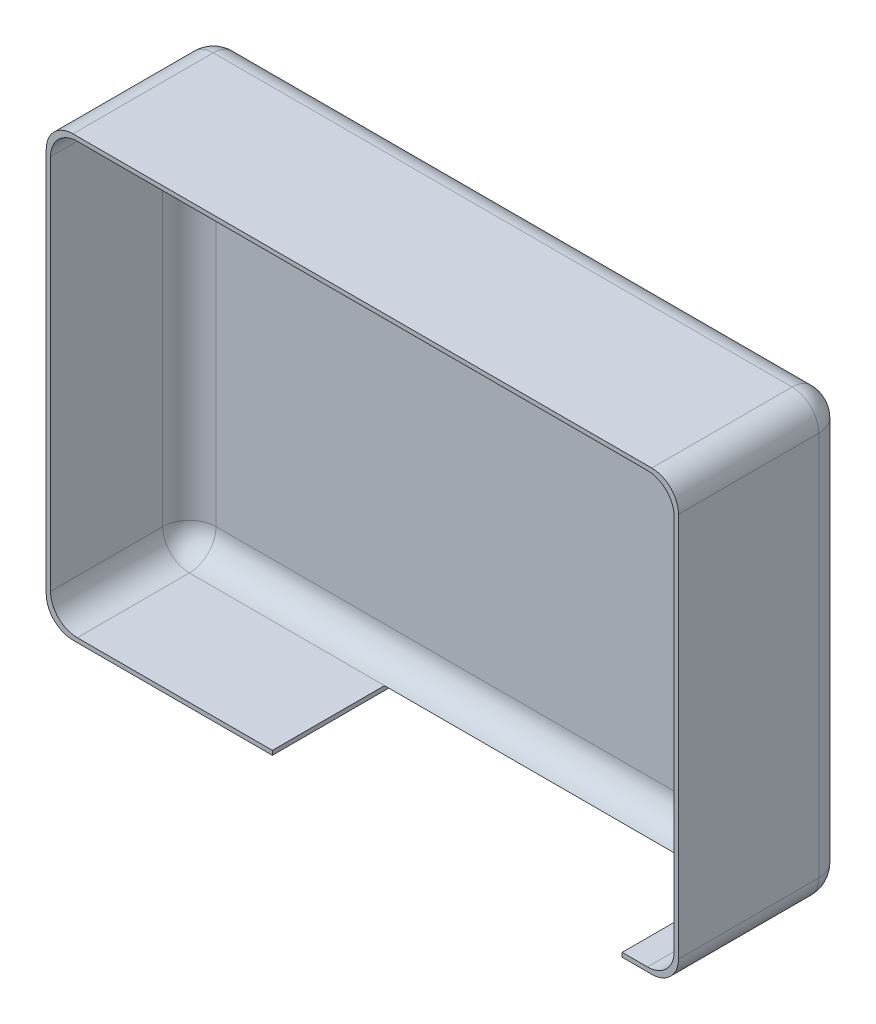
ISO-10303-21;
HEADER;
FILE_DESCRIPTION(('STEP AP214'),'2;1');
FILE_NAME('part.step','',(''),(''),'','','');
FILE_SCHEMA(('AUTOMOTIVE_DESIGN { 1 0 10303 214 1 1 1 1 }'));
ENDSEC;
DATA;
#1=APPLICATION_CONTEXT('core data for automotive mechanical design processes');
#2=APPLICATION_PROTOCOL_DEFINITION('international standard','automotive_design',2000,#1);
#3=PRODUCT_CONTEXT('',#1,'mechanical');
#4=PRODUCT('Part','Part','',(#3));
#5=PRODUCT_RELATED_PRODUCT_CATEGORY('part','',(#4));
#6=PRODUCT_DEFINITION_FORMATION('','',#4);
#7=PRODUCT_DEFINITION_CONTEXT('part definition',#1,'design');
#8=PRODUCT_DEFINITION('design','',#6,#7);
#9=PRODUCT_DEFINITION_SHAPE('','',#8);
#10=(LENGTH_UNIT() NAMED_UNIT(*) SI_UNIT(.MILLI.,.METRE.));
#11=(NAMED_UNIT(*) PLANE_ANGLE_UNIT() SI_UNIT($,.RADIAN.));
#12=(NAMED_UNIT(*) SI_UNIT($,.STERADIAN.) SOLID_ANGLE_UNIT());
#13=UNCERTAINTY_MEASURE_WITH_UNIT(LENGTH_MEASURE(1.E-05),#10,'distance_accuracy_value','');
#14=(GEOMETRIC_REPRESENTATION_CONTEXT(3) GLOBAL_UNCERTAINTY_ASSIGNED_CONTEXT((#13)) GLOBAL_UNIT_ASSIGNED_CONTEXT((#10,
#11,#12)) REPRESENTATION_CONTEXT('',''));
#15=CARTESIAN_POINT('',(0.,0.,0.));
#16=DIRECTION('',(0.,0.,1.));
#17=DIRECTION('',(1.,0.,0.));
#18=AXIS2_PLACEMENT_3D('',#15,#16,#17);
#19=CARTESIAN_POINT('',(-41.4059441680606,-211.369783761646,88.9));
#20=DIRECTION('',(0.,1.,0.));
#21=DIRECTION('',(0.,0.,1.));
#22=AXIS2_PLACEMENT_3D('',#19,#20,#21);
#23=PLANE('',#22);
#24=DIRECTION('',(1.,0.,0.));
#25=VECTOR('',#24,1.);
#26=CARTESIAN_POINT('',(-41.4059441680606,-211.369783761646,88.9));
#27=LINE('',#26,#25);
#28=CARTESIAN_POINT('',(250.965767902829,-211.369783761646,88.9));
#29=VERTEX_POINT('',#28);
#30=CARTESIAN_POINT('',(266.696055831939,-211.369783761646,88.9));
#31=VERTEX_POINT('',#30);
#32=EDGE_CURVE('E285',#29,#31,#27,.T.);
#33=ORIENTED_EDGE('',*,*,#32,.F.);
#34=DIRECTION('',(0.,0.,1.));
#35=VECTOR('',#34,1.);
#36=CARTESIAN_POINT('',(250.965767902829,-211.369783761646,19.304));
#37=LINE('',#36,#35);
#38=CARTESIAN_POINT('',(250.965767902829,-211.369783761646,19.304));
#39=VERTEX_POINT('',#38);
#40=EDGE_CURVE('E218',#39,#29,#37,.T.);
#41=ORIENTED_EDGE('',*,*,#40,.F.);
#42=CARTESIAN_POINT('',(245.885767902829,-211.369783761646,19.304));
#43=DIRECTION('',(0.,-1.,0.));
#44=DIRECTION('',(0.,0.,-1.));
#45=AXIS2_PLACEMENT_3D('',#42,#43,#44);
#46=CIRCLE('',#45,5.08);
#47=CARTESIAN_POINT('',(245.885767902829,-211.369783761646,14.224));
#48=VERTEX_POINT('',#47);
#49=EDGE_CURVE('E907',#48,#39,#46,.T.);
#50=ORIENTED_EDGE('',*,*,#49,.F.);
#51=DIRECTION('',(-1.,0.,0.));
#52=VECTOR('',#51,1.);
#53=CARTESIAN_POINT('',(-41.4059441680606,-211.369783761646,14.224));
#54=LINE('',#53,#52);
#55=CARTESIAN_POINT('',(266.696055831939,-211.369783761646,14.224));
#56=VERTEX_POINT('',#55);
#57=EDGE_CURVE('E56',#48,#56,#54,.F.);
#58=ORIENTED_EDGE('',*,*,#57,.T.);
#59=DIRECTION('',(0.,0.,-1.));
#60=VECTOR('',#59,1.);
#61=CARTESIAN_POINT('',(266.696055831939,-211.369783761646,88.9));
#62=LINE('',#61,#60);
#63=EDGE_CURVE('E309',#31,#56,#62,.T.);
#64=ORIENTED_EDGE('',*,*,#63,.F.);
#65=EDGE_LOOP('',(#33,#41,#50,#58,#64));
#66=FACE_BOUND('',#65,.T.);
#67=ADVANCED_FACE('F33',(#66),#23,.F.);
#68=CARTESIAN_POINT('',(-39.1199441680606,-209.083783761646,14.986));
#69=DIRECTION('',(0.,-1.,0.));
#70=DIRECTION('',(0.,0.,-1.));
#71=AXIS2_PLACEMENT_3D('',#68,#69,#70);
#72=PLANE('',#71);
#73=DIRECTION('',(1.,0.,0.));
#74=VECTOR('',#73,1.);
#75=CARTESIAN_POINT('',(-39.1199441680606,-209.083783761646,29.21));
#76=LINE('',#75,#74);
#77=CARTESIAN_POINT('',(264.410055831939,-209.083783761646,29.21));
#78=VERTEX_POINT('',#77);
#79=CARTESIAN_POINT('',(250.965767902829,-209.083783761646,29.21));
#80=VERTEX_POINT('',#79);
#81=EDGE_CURVE('E232',#78,#80,#76,.F.);
#82=ORIENTED_EDGE('',*,*,#81,.T.);
#83=DIRECTION('',(0.,0.,1.));
#84=VECTOR('',#83,1.);
#85=CARTESIAN_POINT('',(250.965767902829,-209.083783761646,14.986));
#86=LINE('',#85,#84);
#87=CARTESIAN_POINT('',(250.965767902829,-209.083783761646,88.9));
#88=VERTEX_POINT('',#87);
#89=EDGE_CURVE('E11',#80,#88,#86,.T.);
#90=ORIENTED_EDGE('',*,*,#89,.T.);
#91=DIRECTION('',(1.,0.,0.));
#92=VECTOR('',#91,1.);
#93=CARTESIAN_POINT('',(-39.1199441680606,-209.083783761646,88.9));
#94=LINE('',#93,#92);
#95=CARTESIAN_POINT('',(264.410055831939,-209.083783761646,88.9));
#96=VERTEX_POINT('',#95);
#97=EDGE_CURVE('E229',#88,#96,#94,.T.);
#98=ORIENTED_EDGE('',*,*,#97,.T.);
#99=DIRECTION('',(0.,0.,1.));
#100=VECTOR('',#99,1.);
#101=CARTESIAN_POINT('',(264.410055831939,-209.083783761646,14.986));
#102=LINE('',#101,#100);
#103=EDGE_CURVE('E276',#78,#96,#102,.T.);
#104=ORIENTED_EDGE('',*,*,#103,.F.);
#105=EDGE_LOOP('',(#82,#90,#98,#104));
#106=FACE_BOUND('',#105,.T.);
#107=ADVANCED_FACE('F227',(#106),#72,.F.);
#108=CARTESIAN_POINT('',(-41.4059441680608,-197.145783761646,14.224));
#109=DIRECTION('',(-1.,0.,0.));
#110=DIRECTION('',(0.,0.,1.));
#111=AXIS2_PLACEMENT_3D('',#108,#109,#110);
#112=CYLINDRICAL_SURFACE('',#111,14.224);
#113=CARTESIAN_POINT('',(-41.4059441680606,-197.145783761646,14.224));
#114=DIRECTION('',(-1.,0.,0.));
#115=DIRECTION('',(0.,0.,1.));
#116=AXIS2_PLACEMENT_3D('',#113,#114,#115);
#117=CIRCLE('',#116,14.224);
#118=CARTESIAN_POINT('',(-41.4059441680606,-197.145783761646,0.));
#119=VERTEX_POINT('',#118);
#120=CARTESIAN_POINT('',(-41.4059441680606,-211.369783761646,14.224));
#121=VERTEX_POINT('',#120);
#122=EDGE_CURVE('E41',#119,#121,#117,.T.);
#123=ORIENTED_EDGE('',*,*,#122,.F.);
#124=DIRECTION('',(-1.,0.,0.));
#125=VECTOR('',#124,1.);
#126=CARTESIAN_POINT('',(-41.4059441680608,-197.145783761646,0.));
#127=LINE('',#126,#125);
#128=CARTESIAN_POINT('',(266.696055831939,-197.145783761646,0.));
#129=VERTEX_POINT('',#128);
#130=EDGE_CURVE('E377',#129,#119,#127,.T.);
#131=ORIENTED_EDGE('',*,*,#130,.F.);
#132=CARTESIAN_POINT('',(266.696055831939,-197.145783761646,14.224));
#133=DIRECTION('',(-1.,0.,0.));
#134=DIRECTION('',(0.,-1.,0.));
#135=AXIS2_PLACEMENT_3D('',#132,#133,#134);
#136=CIRCLE('',#135,14.224);
#137=EDGE_CURVE('E422',#129,#56,#136,.T.);
#138=ORIENTED_EDGE('',*,*,#137,.T.);
#139=ORIENTED_EDGE('',*,*,#57,.F.);
#140=DIRECTION('',(1.,0.,0.));
#141=VECTOR('',#140,1.);
#142=CARTESIAN_POINT('',(69.838151490582,-211.369783761646,14.224));
#143=LINE('',#142,#141);
#144=CARTESIAN_POINT('',(69.838151490582,-211.369783761646,14.224));
#145=VERTEX_POINT('',#144);
#146=EDGE_CURVE('E433',#145,#48,#143,.T.);
#147=ORIENTED_EDGE('',*,*,#146,.F.);
#148=EDGE_CURVE('E407',#121,#145,#54,.F.);
#149=ORIENTED_EDGE('',*,*,#148,.F.);
#150=EDGE_LOOP('',(#123,#131,#138,#139,#147,#149));
#151=FACE_BOUND('',#150,.T.);
#152=ADVANCED_FACE('F35',(#151),#112,.T.);
#153=CARTESIAN_POINT('',(266.696055831939,-197.145783761646,14.224));
#154=DIRECTION('',(0.,0.,1.));
#155=DIRECTION('',(1.,0.,0.));
#156=AXIS2_PLACEMENT_3D('',#153,#154,#155);
#157=SPHERICAL_SURFACE('',#156,14.224);
#158=ORIENTED_EDGE('',*,*,#137,.F.);
#159=CARTESIAN_POINT('',(266.696055831939,-197.145783761645,14.224));
#160=DIRECTION('',(0.,-1.,0.));
#161=DIRECTION('',(0.,0.,-1.));
#162=AXIS2_PLACEMENT_3D('',#159,#160,#161);
#163=CIRCLE('',#162,14.224);
#164=CARTESIAN_POINT('',(280.920055831939,-197.145783761645,14.224));
#165=VERTEX_POINT('',#164);
#166=EDGE_CURVE('E420',#129,#165,#163,.T.);
#167=ORIENTED_EDGE('',*,*,#166,.T.);
#168=CARTESIAN_POINT('',(266.696055831939,-197.145783761646,14.224));
#169=DIRECTION('',(0.,0.,-1.));
#170=DIRECTION('',(-1.,0.,0.));
#171=AXIS2_PLACEMENT_3D('',#168,#169,#170);
#172=CIRCLE('',#171,14.224);
#173=EDGE_CURVE('E404',#56,#165,#172,.F.);
#174=ORIENTED_EDGE('',*,*,#173,.F.);
#175=EDGE_LOOP('',(#158,#167,#174));
#176=FACE_BOUND('',#175,.T.);
#177=ADVANCED_FACE('F463',(#176),#157,.T.);
#178=CARTESIAN_POINT('',(266.696055831939,7.83221623835449,14.224));
#179=DIRECTION('',(0.,-1.,0.));
#180=DIRECTION('',(1.,0.,0.));
#181=AXIS2_PLACEMENT_3D('',#178,#179,#180);
#182=CYLINDRICAL_SURFACE('',#181,14.224);
#183=ORIENTED_EDGE('',*,*,#166,.F.);
#184=DIRECTION('',(0.,-1.,0.));
#185=VECTOR('',#184,1.);
#186=CARTESIAN_POINT('',(266.696055831939,7.83221623835449,0.));
#187=LINE('',#186,#185);
#188=CARTESIAN_POINT('',(266.696055831939,7.83221623835431,0.));
#189=VERTEX_POINT('',#188);
#190=EDGE_CURVE('E380',#189,#129,#187,.T.);
#191=ORIENTED_EDGE('',*,*,#190,.F.);
#192=CARTESIAN_POINT('',(266.696055831939,7.83221623835441,14.224));
#193=DIRECTION('',(0.,-1.,0.));
#194=DIRECTION('',(1.,0.,0.));
#195=AXIS2_PLACEMENT_3D('',#192,#193,#194);
#196=CIRCLE('',#195,14.224);
#197=CARTESIAN_POINT('',(280.920055831939,7.83221623835431,14.224));
#198=VERTEX_POINT('',#197);
#199=EDGE_CURVE('E418',#189,#198,#196,.T.);
#200=ORIENTED_EDGE('',*,*,#199,.T.);
#201=DIRECTION('',(0.,-1.,0.));
#202=VECTOR('',#201,1.);
#203=CARTESIAN_POINT('',(280.920055831939,7.83221623835431,14.224));
#204=LINE('',#203,#202);
#205=EDGE_CURVE('E401',#165,#198,#204,.F.);
#206=ORIENTED_EDGE('',*,*,#205,.F.);
#207=EDGE_LOOP('',(#183,#191,#200,#206));
#208=FACE_BOUND('',#207,.T.);
#209=ADVANCED_FACE('F492',(#208),#182,.T.);
#210=CARTESIAN_POINT('',(266.696055831939,7.83221623835441,14.224));
#211=DIRECTION('',(0.,0.,1.));
#212=DIRECTION('',(1.,0.,0.));
#213=AXIS2_PLACEMENT_3D('',#210,#211,#212);
#214=SPHERICAL_SURFACE('',#213,14.224);
#215=ORIENTED_EDGE('',*,*,#199,.F.);
#216=CARTESIAN_POINT('',(266.696055831939,7.83221623835441,14.224));
#217=DIRECTION('',(1.,0.,0.));
#218=DIRECTION('',(0.,0.,-1.));
#219=AXIS2_PLACEMENT_3D('',#216,#217,#218);
#220=CIRCLE('',#219,14.224);
#221=CARTESIAN_POINT('',(266.696055831939,22.0562162383544,14.224));
#222=VERTEX_POINT('',#221);
#223=EDGE_CURVE('E416',#189,#222,#220,.T.);
#224=ORIENTED_EDGE('',*,*,#223,.T.);
#225=CARTESIAN_POINT('',(266.696055831939,7.83221623835441,14.224));
#226=DIRECTION('',(0.,0.,-1.));
#227=DIRECTION('',(-1.,0.,0.));
#228=AXIS2_PLACEMENT_3D('',#225,#226,#227);
#229=CIRCLE('',#228,14.224);
#230=EDGE_CURVE('E398',#198,#222,#229,.F.);
#231=ORIENTED_EDGE('',*,*,#230,.F.);
#232=EDGE_LOOP('',(#215,#224,#231));
#233=FACE_BOUND('',#232,.T.);
#234=ADVANCED_FACE('F494',(#233),#214,.T.);
#235=CARTESIAN_POINT('',(-41.4059441680608,7.83221623835441,14.224));
#236=DIRECTION('',(1.,0.,0.));
#237=DIRECTION('',(0.,0.,-1.));
#238=AXIS2_PLACEMENT_3D('',#235,#236,#237);
#239=CYLINDRICAL_SURFACE('',#238,14.224);
#240=ORIENTED_EDGE('',*,*,#223,.F.);
#241=DIRECTION('',(1.,0.,0.));
#242=VECTOR('',#241,1.);
#243=CARTESIAN_POINT('',(-41.4059441680608,7.83221623835441,0.));
#244=LINE('',#243,#242);
#245=CARTESIAN_POINT('',(-41.4059441680607,7.83221623835441,0.));
#246=VERTEX_POINT('',#245);
#247=EDGE_CURVE('E383',#246,#189,#244,.T.);
#248=ORIENTED_EDGE('',*,*,#247,.F.);
#249=CARTESIAN_POINT('',(-41.4059441680608,7.83221623835441,14.224));
#250=DIRECTION('',(1.,0.,0.));
#251=DIRECTION('',(0.,1.,0.));
#252=AXIS2_PLACEMENT_3D('',#249,#250,#251);
#253=CIRCLE('',#252,14.224);
#254=CARTESIAN_POINT('',(-41.4059441680607,22.0562162383544,14.224));
#255=VERTEX_POINT('',#254);
#256=EDGE_CURVE('E414',#246,#255,#253,.T.);
#257=ORIENTED_EDGE('',*,*,#256,.T.);
#258=DIRECTION('',(1.,0.,0.));
#259=VECTOR('',#258,1.);
#260=CARTESIAN_POINT('',(-41.4059441680607,22.0562162383544,14.224));
#261=LINE('',#260,#259);
#262=EDGE_CURVE('E395',#222,#255,#261,.F.);
#263=ORIENTED_EDGE('',*,*,#262,.F.);
#264=EDGE_LOOP('',(#240,#248,#257,#263));
#265=FACE_BOUND('',#264,.T.);
#266=ADVANCED_FACE('F490',(#265),#239,.T.);
#267=CARTESIAN_POINT('',(-41.4059441680608,7.83221623835441,14.224));
#268=DIRECTION('',(0.,0.,1.));
#269=DIRECTION('',(1.,0.,0.));
#270=AXIS2_PLACEMENT_3D('',#267,#268,#269);
#271=SPHERICAL_SURFACE('',#270,14.224);
#272=ORIENTED_EDGE('',*,*,#256,.F.);
#273=CARTESIAN_POINT('',(-41.4059441680608,7.83221623835431,14.224));
#274=DIRECTION('',(0.,1.,0.));
#275=DIRECTION('',(-1.,0.,0.));
#276=AXIS2_PLACEMENT_3D('',#273,#274,#275);
#277=CIRCLE('',#276,14.224);
#278=CARTESIAN_POINT('',(-55.6299441680608,7.83221623835431,14.224));
#279=VERTEX_POINT('',#278);
#280=EDGE_CURVE('E412',#246,#279,#277,.T.);
#281=ORIENTED_EDGE('',*,*,#280,.T.);
#282=CARTESIAN_POINT('',(-41.4059441680608,7.83221623835441,14.224));
#283=DIRECTION('',(0.,0.,-1.));
#284=DIRECTION('',(-1.,0.,0.));
#285=AXIS2_PLACEMENT_3D('',#282,#283,#284);
#286=CIRCLE('',#285,14.224);
#287=EDGE_CURVE('E392',#255,#279,#286,.F.);
#288=ORIENTED_EDGE('',*,*,#287,.F.);
#289=EDGE_LOOP('',(#272,#281,#288));
#290=FACE_BOUND('',#289,.T.);
#291=ADVANCED_FACE('F487',(#290),#271,.T.);
#292=CARTESIAN_POINT('',(-41.4059441680608,7.83221623835441,14.224));
#293=DIRECTION('',(0.,1.,0.));
#294=DIRECTION('',(-1.,0.,0.));
#295=AXIS2_PLACEMENT_3D('',#292,#293,#294);
#296=CYLINDRICAL_SURFACE('',#295,14.224);
#297=ORIENTED_EDGE('',*,*,#280,.F.);
#298=DIRECTION('',(0.,1.,0.));
#299=VECTOR('',#298,1.);
#300=CARTESIAN_POINT('',(-41.4059441680608,7.83221623835441,0.));
#301=LINE('',#300,#299);
#302=EDGE_CURVE('E386',#119,#246,#301,.T.);
#303=ORIENTED_EDGE('',*,*,#302,.F.);
#304=CARTESIAN_POINT('',(-41.4059441680607,-197.145783761646,14.224));
#305=DIRECTION('',(0.,1.,0.));
#306=DIRECTION('',(-1.,0.,0.));
#307=AXIS2_PLACEMENT_3D('',#304,#305,#306);
#308=CIRCLE('',#307,14.224);
#309=CARTESIAN_POINT('',(-55.6299441680607,-197.145783761645,14.224));
#310=VERTEX_POINT('',#309);
#311=EDGE_CURVE('E410',#119,#310,#308,.T.);
#312=ORIENTED_EDGE('',*,*,#311,.T.);
#313=DIRECTION('',(0.,1.,0.));
#314=VECTOR('',#313,1.);
#315=CARTESIAN_POINT('',(-55.6299441680608,7.83221623835431,14.224));
#316=LINE('',#315,#314);
#317=EDGE_CURVE('E389',#279,#310,#316,.F.);
#318=ORIENTED_EDGE('',*,*,#317,.F.);
#319=EDGE_LOOP('',(#297,#303,#312,#318));
#320=FACE_BOUND('',#319,.T.);
#321=ADVANCED_FACE('F455',(#320),#296,.T.);
#322=CARTESIAN_POINT('',(-41.4059441680607,-197.145783761646,14.224));
#323=DIRECTION('',(0.,0.,1.));
#324=DIRECTION('',(1.,0.,0.));
#325=AXIS2_PLACEMENT_3D('',#322,#323,#324);
#326=SPHERICAL_SURFACE('',#325,14.224);
#327=ORIENTED_EDGE('',*,*,#311,.F.);
#328=ORIENTED_EDGE('',*,*,#122,.T.);
#329=CARTESIAN_POINT('',(-41.4059441680607,-197.145783761646,14.224));
#330=DIRECTION('',(0.,0.,-1.));
#331=DIRECTION('',(-1.,0.,0.));
#332=AXIS2_PLACEMENT_3D('',#329,#330,#331);
#333=CIRCLE('',#332,14.224);
#334=EDGE_CURVE('E374',#310,#121,#333,.F.);
#335=ORIENTED_EDGE('',*,*,#334,.F.);
#336=EDGE_LOOP('',(#327,#328,#335));
#337=FACE_BOUND('',#336,.T.);
#338=ADVANCED_FACE('F427',(#337),#326,.T.);
#339=CARTESIAN_POINT('',(-39.1199441680606,-194.859783761646,29.21));
#340=DIRECTION('',(0.,-1.,0.));
#341=DIRECTION('',(1.,0.,0.));
#342=AXIS2_PLACEMENT_3D('',#339,#340,#341);
#343=CYLINDRICAL_SURFACE('',#342,14.224);
#344=CARTESIAN_POINT('',(-39.1199441680606,-194.859783761646,29.21));
#345=DIRECTION('',(0.,1.,0.));
#346=DIRECTION('',(0.,0.,1.));
#347=AXIS2_PLACEMENT_3D('',#344,#345,#346);
#348=CIRCLE('',#347,14.224);
#349=CARTESIAN_POINT('',(-39.1199441680606,-194.859783761646,14.986));
#350=VERTEX_POINT('',#349);
#351=CARTESIAN_POINT('',(-53.3439441680606,-194.859783761646,29.21));
#352=VERTEX_POINT('',#351);
#353=EDGE_CURVE('E372',#350,#352,#348,.T.);
#354=ORIENTED_EDGE('',*,*,#353,.F.);
#355=DIRECTION('',(0.,-1.,0.));
#356=VECTOR('',#355,1.);
#357=CARTESIAN_POINT('',(-39.1199441680606,-194.859783761646,14.986));
#358=LINE('',#357,#356);
#359=CARTESIAN_POINT('',(-39.1199441680608,5.54621623835437,14.986));
#360=VERTEX_POINT('',#359);
#361=EDGE_CURVE('E324',#360,#350,#358,.T.);
#362=ORIENTED_EDGE('',*,*,#361,.F.);
#363=CARTESIAN_POINT('',(-39.1199441680608,5.5462162383544,29.21));
#364=DIRECTION('',(0.,1.,0.));
#365=DIRECTION('',(-1.,0.,0.));
#366=AXIS2_PLACEMENT_3D('',#363,#364,#365);
#367=CIRCLE('',#366,14.224);
#368=CARTESIAN_POINT('',(-53.3439441680608,5.54621623835436,29.21));
#369=VERTEX_POINT('',#368);
#370=EDGE_CURVE('E370',#360,#369,#367,.T.);
#371=ORIENTED_EDGE('',*,*,#370,.T.);
#372=DIRECTION('',(0.,-1.,0.));
#373=VECTOR('',#372,1.);
#374=CARTESIAN_POINT('',(-53.3439441680606,-194.859783761646,29.21));
#375=LINE('',#374,#373);
#376=EDGE_CURVE('E354',#352,#369,#375,.F.);
#377=ORIENTED_EDGE('',*,*,#376,.F.);
#378=EDGE_LOOP('',(#354,#362,#371,#377));
#379=FACE_BOUND('',#378,.T.);
#380=ADVANCED_FACE('F551',(#379),#343,.F.);
#381=CARTESIAN_POINT('',(-39.1199441680607,5.5462162383544,29.21));
#382=DIRECTION('',(0.,0.,1.));
#383=DIRECTION('',(1.,0.,0.));
#384=AXIS2_PLACEMENT_3D('',#381,#382,#383);
#385=SPHERICAL_SURFACE('',#384,14.224);
#386=ORIENTED_EDGE('',*,*,#370,.F.);
#387=CARTESIAN_POINT('',(-39.1199441680608,5.54621623835442,29.21));
#388=DIRECTION('',(1.,0.,0.));
#389=DIRECTION('',(0.,0.,-1.));
#390=AXIS2_PLACEMENT_3D('',#387,#388,#389);
#391=CIRCLE('',#390,14.224);
#392=CARTESIAN_POINT('',(-39.1199441680608,19.7702162383544,29.21));
#393=VERTEX_POINT('',#392);
#394=EDGE_CURVE('E368',#360,#393,#391,.T.);
#395=ORIENTED_EDGE('',*,*,#394,.T.);
#396=CARTESIAN_POINT('',(-39.1199441680607,5.5462162383544,29.21));
#397=DIRECTION('',(0.,0.,1.));
#398=DIRECTION('',(1.,0.,0.));
#399=AXIS2_PLACEMENT_3D('',#396,#397,#398);
#400=CIRCLE('',#399,14.224);
#401=EDGE_CURVE('E351',#369,#393,#400,.F.);
#402=ORIENTED_EDGE('',*,*,#401,.F.);
#403=EDGE_LOOP('',(#386,#395,#402));
#404=FACE_BOUND('',#403,.T.);
#405=ADVANCED_FACE('F547',(#404),#385,.F.);
#406=CARTESIAN_POINT('',(-39.1199441680606,5.54621623835441,29.21));
#407=DIRECTION('',(-1.,0.,0.));
#408=DIRECTION('',(0.,0.,1.));
#409=AXIS2_PLACEMENT_3D('',#406,#407,#408);
#410=CYLINDRICAL_SURFACE('',#409,14.224);
#411=ORIENTED_EDGE('',*,*,#394,.F.);
#412=DIRECTION('',(-1.,0.,0.));
#413=VECTOR('',#412,1.);
#414=CARTESIAN_POINT('',(-39.1199441680606,5.54621623835441,14.986));
#415=LINE('',#414,#413);
#416=CARTESIAN_POINT('',(264.410055831939,5.5462162383544,14.986));
#417=VERTEX_POINT('',#416);
#418=EDGE_CURVE('E327',#417,#360,#415,.T.);
#419=ORIENTED_EDGE('',*,*,#418,.F.);
#420=CARTESIAN_POINT('',(264.410055831939,5.5462162383544,29.21));
#421=DIRECTION('',(1.,0.,0.));
#422=DIRECTION('',(0.,0.,-1.));
#423=AXIS2_PLACEMENT_3D('',#420,#421,#422);
#424=CIRCLE('',#423,14.224);
#425=CARTESIAN_POINT('',(264.410055831939,19.7702162383544,29.21));
#426=VERTEX_POINT('',#425);
#427=EDGE_CURVE('E366',#417,#426,#424,.T.);
#428=ORIENTED_EDGE('',*,*,#427,.T.);
#429=DIRECTION('',(-1.,0.,0.));
#430=VECTOR('',#429,1.);
#431=CARTESIAN_POINT('',(-39.1199441680608,19.7702162383544,29.21));
#432=LINE('',#431,#430);
#433=EDGE_CURVE('E348',#393,#426,#432,.F.);
#434=ORIENTED_EDGE('',*,*,#433,.F.);
#435=EDGE_LOOP('',(#411,#419,#428,#434));
#436=FACE_BOUND('',#435,.T.);
#437=ADVANCED_FACE('F543',(#436),#410,.F.);
#438=CARTESIAN_POINT('',(264.410055831939,5.5462162383544,29.21));
#439=DIRECTION('',(0.,0.,1.));
#440=DIRECTION('',(1.,0.,0.));
#441=AXIS2_PLACEMENT_3D('',#438,#439,#440);
#442=SPHERICAL_SURFACE('',#441,14.224);
#443=ORIENTED_EDGE('',*,*,#427,.F.);
#444=CARTESIAN_POINT('',(264.410055831939,5.5462162383544,29.21));
#445=DIRECTION('',(0.,-1.,0.));
#446=DIRECTION('',(0.,0.,-1.));
#447=AXIS2_PLACEMENT_3D('',#444,#445,#446);
#448=CIRCLE('',#447,14.224);
#449=CARTESIAN_POINT('',(278.634055831939,5.5462162383544,29.21));
#450=VERTEX_POINT('',#449);
#451=EDGE_CURVE('E364',#417,#450,#448,.T.);
#452=ORIENTED_EDGE('',*,*,#451,.T.);
#453=CARTESIAN_POINT('',(264.410055831939,5.5462162383544,29.21));
#454=DIRECTION('',(0.,0.,1.));
#455=DIRECTION('',(1.,0.,0.));
#456=AXIS2_PLACEMENT_3D('',#453,#454,#455);
#457=CIRCLE('',#456,14.224);
#458=EDGE_CURVE('E345',#426,#450,#457,.F.);
#459=ORIENTED_EDGE('',*,*,#458,.F.);
#460=EDGE_LOOP('',(#443,#452,#459));
#461=FACE_BOUND('',#460,.T.);
#462=ADVANCED_FACE('F539',(#461),#442,.F.);
#463=CARTESIAN_POINT('',(264.410055831939,-194.859783761646,29.21));
#464=DIRECTION('',(0.,1.,0.));
#465=DIRECTION('',(0.,0.,1.));
#466=AXIS2_PLACEMENT_3D('',#463,#464,#465);
#467=CYLINDRICAL_SURFACE('',#466,14.224);
#468=ORIENTED_EDGE('',*,*,#451,.F.);
#469=DIRECTION('',(0.,1.,0.));
#470=VECTOR('',#469,1.);
#471=CARTESIAN_POINT('',(264.410055831939,-194.859783761646,14.986));
#472=LINE('',#471,#470);
#473=CARTESIAN_POINT('',(264.410055831939,-194.859783761646,14.986));
#474=VERTEX_POINT('',#473);
#475=EDGE_CURVE('E330',#474,#417,#472,.T.);
#476=ORIENTED_EDGE('',*,*,#475,.F.);
#477=CARTESIAN_POINT('',(264.410055831939,-194.859783761646,29.21));
#478=DIRECTION('',(0.,-1.,0.));
#479=DIRECTION('',(0.,0.,-1.));
#480=AXIS2_PLACEMENT_3D('',#477,#478,#479);
#481=CIRCLE('',#480,14.224);
#482=CARTESIAN_POINT('',(278.634055831939,-194.859783761646,29.21));
#483=VERTEX_POINT('',#482);
#484=EDGE_CURVE('E362',#474,#483,#481,.T.);
#485=ORIENTED_EDGE('',*,*,#484,.T.);
#486=DIRECTION('',(0.,1.,0.));
#487=VECTOR('',#486,1.);
#488=CARTESIAN_POINT('',(278.634055831939,-194.859783761646,29.21));
#489=LINE('',#488,#487);
#490=EDGE_CURVE('E342',#450,#483,#489,.F.);
#491=ORIENTED_EDGE('',*,*,#490,.F.);
#492=EDGE_LOOP('',(#468,#476,#485,#491));
#493=FACE_BOUND('',#492,.T.);
#494=ADVANCED_FACE('F535',(#493),#467,.F.);
#495=CARTESIAN_POINT('',(264.410055831939,-194.859783761646,29.21));
#496=DIRECTION('',(0.,0.,1.));
#497=DIRECTION('',(1.,0.,0.));
#498=AXIS2_PLACEMENT_3D('',#495,#496,#497);
#499=SPHERICAL_SURFACE('',#498,14.224);
#500=ORIENTED_EDGE('',*,*,#484,.F.);
#501=CARTESIAN_POINT('',(264.410055831939,-194.859783761646,29.21));
#502=DIRECTION('',(-1.,0.,0.));
#503=DIRECTION('',(0.,0.,1.));
#504=AXIS2_PLACEMENT_3D('',#501,#502,#503);
#505=CIRCLE('',#504,14.224);
#506=EDGE_CURVE('E360',#474,#78,#505,.T.);
#507=ORIENTED_EDGE('',*,*,#506,.T.);
#508=CARTESIAN_POINT('',(264.410055831939,-194.859783761646,29.21));
#509=DIRECTION('',(0.,0.,1.));
#510=DIRECTION('',(1.,0.,0.));
#511=AXIS2_PLACEMENT_3D('',#508,#509,#510);
#512=CIRCLE('',#511,14.224);
#513=EDGE_CURVE('E338',#483,#78,#512,.F.);
#514=ORIENTED_EDGE('',*,*,#513,.F.);
#515=EDGE_LOOP('',(#500,#507,#514));
#516=FACE_BOUND('',#515,.T.);
#517=ADVANCED_FACE('F531',(#516),#499,.F.);
#518=CARTESIAN_POINT('',(-39.1199441680606,-194.859783761646,29.21));
#519=DIRECTION('',(1.,0.,0.));
#520=DIRECTION('',(0.,0.,-1.));
#521=AXIS2_PLACEMENT_3D('',#518,#519,#520);
#522=CYLINDRICAL_SURFACE('',#521,14.224);
#523=ORIENTED_EDGE('',*,*,#506,.F.);
#524=DIRECTION('',(1.,0.,0.));
#525=VECTOR('',#524,1.);
#526=CARTESIAN_POINT('',(-39.1199441680606,-194.859783761646,14.986));
#527=LINE('',#526,#525);
#528=EDGE_CURVE('E333',#350,#474,#527,.T.);
#529=ORIENTED_EDGE('',*,*,#528,.F.);
#530=CARTESIAN_POINT('',(-39.1199441680606,-194.859783761646,29.21));
#531=DIRECTION('',(-1.,0.,0.));
#532=DIRECTION('',(0.,0.,1.));
#533=AXIS2_PLACEMENT_3D('',#530,#531,#532);
#534=CIRCLE('',#533,14.224);
#535=CARTESIAN_POINT('',(-39.1199441680606,-209.083783761646,29.21));
#536=VERTEX_POINT('',#535);
#537=EDGE_CURVE('E357',#350,#536,#534,.T.);
#538=ORIENTED_EDGE('',*,*,#537,.T.);
#539=CARTESIAN_POINT('',(64.7581514905819,-209.083783761646,29.21));
#540=VERTEX_POINT('',#539);
#541=EDGE_CURVE('E336',#540,#536,#76,.F.);
#542=ORIENTED_EDGE('',*,*,#541,.F.);
#543=EDGE_CURVE('E339',#80,#540,#76,.F.);
#544=ORIENTED_EDGE('',*,*,#543,.F.);
#545=ORIENTED_EDGE('',*,*,#81,.F.);
#546=EDGE_LOOP('',(#523,#529,#538,#542,#544,#545));
#547=FACE_BOUND('',#546,.T.);
#548=ADVANCED_FACE('F527',(#547),#522,.F.);
#549=CARTESIAN_POINT('',(-39.1199441680606,-194.859783761646,29.21));
#550=DIRECTION('',(0.,0.,1.));
#551=DIRECTION('',(1.,0.,0.));
#552=AXIS2_PLACEMENT_3D('',#549,#550,#551);
#553=SPHERICAL_SURFACE('',#552,14.224);
#554=ORIENTED_EDGE('',*,*,#537,.F.);
#555=ORIENTED_EDGE('',*,*,#353,.T.);
#556=CARTESIAN_POINT('',(-39.1199441680606,-194.859783761646,29.21));
#557=DIRECTION('',(0.,0.,1.));
#558=DIRECTION('',(1.,0.,0.));
#559=AXIS2_PLACEMENT_3D('',#556,#557,#558);
#560=CIRCLE('',#559,14.224);
#561=EDGE_CURVE('E321',#536,#352,#560,.F.);
#562=ORIENTED_EDGE('',*,*,#561,.F.);
#563=EDGE_LOOP('',(#554,#555,#562));
#564=FACE_BOUND('',#563,.T.);
#565=ADVANCED_FACE('F524',(#564),#553,.F.);
#566=CARTESIAN_POINT('',(-41.4059441680608,7.83221623835441,88.9));
#567=DIRECTION('',(0.,0.,-1.));
#568=DIRECTION('',(-1.,0.,0.));
#569=AXIS2_PLACEMENT_3D('',#566,#567,#568);
#570=CYLINDRICAL_SURFACE('',#569,14.224);
#571=DIRECTION('',(0.,0.,-1.));
#572=VECTOR('',#571,1.);
#573=CARTESIAN_POINT('',(-41.4059441680607,22.0562162383544,88.9));
#574=LINE('',#573,#572);
#575=CARTESIAN_POINT('',(-41.4059441680607,22.0562162383544,88.9));
#576=VERTEX_POINT('',#575);
#577=EDGE_CURVE('E297',#576,#255,#574,.T.);
#578=ORIENTED_EDGE('',*,*,#577,.T.);
#579=ORIENTED_EDGE('',*,*,#287,.T.);
#580=DIRECTION('',(0.,0.,-1.));
#581=VECTOR('',#580,1.);
#582=CARTESIAN_POINT('',(-55.6299441680608,7.83221623835431,88.9));
#583=LINE('',#582,#581);
#584=CARTESIAN_POINT('',(-55.6299441680608,7.83221623835431,88.9));
#585=VERTEX_POINT('',#584);
#586=EDGE_CURVE('E318',#585,#279,#583,.T.);
#587=ORIENTED_EDGE('',*,*,#586,.F.);
#588=CARTESIAN_POINT('',(-41.4059441680608,7.83221623835441,88.9));
#589=DIRECTION('',(0.,0.,1.));
#590=DIRECTION('',(1.,0.,0.));
#591=AXIS2_PLACEMENT_3D('',#588,#589,#590);
#592=CIRCLE('',#591,14.224);
#593=EDGE_CURVE('E265',#576,#585,#592,.T.);
#594=ORIENTED_EDGE('',*,*,#593,.F.);
#595=EDGE_LOOP('',(#578,#579,#587,#594));
#596=FACE_BOUND('',#595,.T.);
#597=ADVANCED_FACE('F485',(#596),#570,.T.);
#598=CARTESIAN_POINT('',(-55.6299441680608,7.83221623835431,88.9));
#599=DIRECTION('',(1.,0.,0.));
#600=DIRECTION('',(0.,1.,0.));
#601=AXIS2_PLACEMENT_3D('',#598,#599,#600);
#602=PLANE('',#601);
#603=ORIENTED_EDGE('',*,*,#586,.T.);
#604=ORIENTED_EDGE('',*,*,#317,.T.);
#605=DIRECTION('',(0.,0.,-1.));
#606=VECTOR('',#605,1.);
#607=CARTESIAN_POINT('',(-55.6299441680607,-197.145783761645,88.9));
#608=LINE('',#607,#606);
#609=CARTESIAN_POINT('',(-55.6299441680607,-197.145783761645,88.9));
#610=VERTEX_POINT('',#609);
#611=EDGE_CURVE('E315',#610,#310,#608,.T.);
#612=ORIENTED_EDGE('',*,*,#611,.F.);
#613=DIRECTION('',(0.,-1.,0.));
#614=VECTOR('',#613,1.);
#615=CARTESIAN_POINT('',(-55.6299441680608,7.83221623835431,88.9));
#616=LINE('',#615,#614);
#617=EDGE_CURVE('E281',#585,#610,#616,.T.);
#618=ORIENTED_EDGE('',*,*,#617,.F.);
#619=EDGE_LOOP('',(#603,#604,#612,#618));
#620=FACE_BOUND('',#619,.T.);
#621=ADVANCED_FACE('F451',(#620),#602,.F.);
#622=CARTESIAN_POINT('',(-41.4059441680607,-197.145783761646,88.9));
#623=DIRECTION('',(0.,0.,-1.));
#624=DIRECTION('',(-1.,0.,0.));
#625=AXIS2_PLACEMENT_3D('',#622,#623,#624);
#626=CYLINDRICAL_SURFACE('',#625,14.224);
#627=ORIENTED_EDGE('',*,*,#611,.T.);
#628=ORIENTED_EDGE('',*,*,#334,.T.);
#629=DIRECTION('',(0.,0.,-1.));
#630=VECTOR('',#629,1.);
#631=CARTESIAN_POINT('',(-41.4059441680606,-211.369783761646,88.9));
#632=LINE('',#631,#630);
#633=CARTESIAN_POINT('',(-41.4059441680606,-211.369783761646,88.9));
#634=VERTEX_POINT('',#633);
#635=EDGE_CURVE('E312',#634,#121,#632,.T.);
#636=ORIENTED_EDGE('',*,*,#635,.F.);
#637=CARTESIAN_POINT('',(-41.4059441680607,-197.145783761646,88.9));
#638=DIRECTION('',(0.,0.,1.));
#639=DIRECTION('',(1.,0.,0.));
#640=AXIS2_PLACEMENT_3D('',#637,#638,#639);
#641=CIRCLE('',#640,14.224);
#642=EDGE_CURVE('E283',#610,#634,#641,.T.);
#643=ORIENTED_EDGE('',*,*,#642,.F.);
#644=EDGE_LOOP('',(#627,#628,#636,#643));
#645=FACE_BOUND('',#644,.T.);
#646=ADVANCED_FACE('F438',(#645),#626,.T.);
#647=ORIENTED_EDGE('',*,*,#148,.T.);
#648=CARTESIAN_POINT('',(69.8381514905819,-211.369783761646,19.304));
#649=DIRECTION('',(0.,-1.,0.));
#650=DIRECTION('',(0.,0.,1.));
#651=AXIS2_PLACEMENT_3D('',#648,#649,#650);
#652=CIRCLE('',#651,5.08);
#653=CARTESIAN_POINT('',(64.7581514905819,-211.369783761646,19.304));
#654=VERTEX_POINT('',#653);
#655=EDGE_CURVE('E903',#654,#145,#652,.T.);
#656=ORIENTED_EDGE('',*,*,#655,.F.);
#657=DIRECTION('',(0.,0.,-1.));
#658=VECTOR('',#657,1.);
#659=CARTESIAN_POINT('',(64.7581514905819,-211.369783761646,19.304));
#660=LINE('',#659,#658);
#661=CARTESIAN_POINT('',(64.7581514905819,-211.369783761646,88.9));
#662=VERTEX_POINT('',#661);
#663=EDGE_CURVE('E445',#662,#654,#660,.T.);
#664=ORIENTED_EDGE('',*,*,#663,.F.);
#665=EDGE_CURVE('E286',#634,#662,#27,.T.);
#666=ORIENTED_EDGE('',*,*,#665,.F.);
#667=ORIENTED_EDGE('',*,*,#635,.T.);
#668=EDGE_LOOP('',(#647,#656,#664,#666,#667));
#669=FACE_BOUND('',#668,.T.);
#670=ADVANCED_FACE('F442',(#669),#23,.F.);
#671=CARTESIAN_POINT('',(266.696055831939,-197.145783761646,88.9));
#672=DIRECTION('',(0.,0.,-1.));
#673=DIRECTION('',(-1.,0.,0.));
#674=AXIS2_PLACEMENT_3D('',#671,#672,#673);
#675=CYLINDRICAL_SURFACE('',#674,14.224);
#676=ORIENTED_EDGE('',*,*,#63,.T.);
#677=ORIENTED_EDGE('',*,*,#173,.T.);
#678=DIRECTION('',(0.,0.,-1.));
#679=VECTOR('',#678,1.);
#680=CARTESIAN_POINT('',(280.920055831939,-197.145783761645,88.9));
#681=LINE('',#680,#679);
#682=CARTESIAN_POINT('',(280.920055831939,-197.145783761645,88.9));
#683=VERTEX_POINT('',#682);
#684=EDGE_CURVE('E306',#683,#165,#681,.T.);
#685=ORIENTED_EDGE('',*,*,#684,.F.);
#686=CARTESIAN_POINT('',(266.696055831939,-197.145783761646,88.9));
#687=DIRECTION('',(0.,0.,1.));
#688=DIRECTION('',(1.,0.,0.));
#689=AXIS2_PLACEMENT_3D('',#686,#687,#688);
#690=CIRCLE('',#689,14.224);
#691=EDGE_CURVE('E289',#31,#683,#690,.T.);
#692=ORIENTED_EDGE('',*,*,#691,.F.);
#693=EDGE_LOOP('',(#676,#677,#685,#692));
#694=FACE_BOUND('',#693,.T.);
#695=ADVANCED_FACE('F468',(#694),#675,.T.);
#696=CARTESIAN_POINT('',(280.920055831939,7.83221623835431,88.9));
#697=DIRECTION('',(-1.,0.,0.));
#698=DIRECTION('',(0.,-1.,0.));
#699=AXIS2_PLACEMENT_3D('',#696,#697,#698);
#700=PLANE('',#699);
#701=ORIENTED_EDGE('',*,*,#684,.T.);
#702=ORIENTED_EDGE('',*,*,#205,.T.);
#703=DIRECTION('',(0.,0.,-1.));
#704=VECTOR('',#703,1.);
#705=CARTESIAN_POINT('',(280.920055831939,7.83221623835431,88.9));
#706=LINE('',#705,#704);
#707=CARTESIAN_POINT('',(280.920055831939,7.83221623835431,88.9));
#708=VERTEX_POINT('',#707);
#709=EDGE_CURVE('E303',#708,#198,#706,.T.);
#710=ORIENTED_EDGE('',*,*,#709,.F.);
#711=DIRECTION('',(0.,1.,0.));
#712=VECTOR('',#711,1.);
#713=CARTESIAN_POINT('',(280.920055831939,7.83221623835431,88.9));
#714=LINE('',#713,#712);
#715=EDGE_CURVE('E291',#683,#708,#714,.T.);
#716=ORIENTED_EDGE('',*,*,#715,.F.);
#717=EDGE_LOOP('',(#701,#702,#710,#716));
#718=FACE_BOUND('',#717,.T.);
#719=ADVANCED_FACE('F472',(#718),#700,.F.);
#720=CARTESIAN_POINT('',(266.696055831939,7.83221623835441,88.9));
#721=DIRECTION('',(0.,0.,-1.));
#722=DIRECTION('',(-1.,0.,0.));
#723=AXIS2_PLACEMENT_3D('',#720,#721,#722);
#724=CYLINDRICAL_SURFACE('',#723,14.224);
#725=ORIENTED_EDGE('',*,*,#709,.T.);
#726=ORIENTED_EDGE('',*,*,#230,.T.);
#727=DIRECTION('',(0.,0.,-1.));
#728=VECTOR('',#727,1.);
#729=CARTESIAN_POINT('',(266.696055831939,22.0562162383544,88.9));
#730=LINE('',#729,#728);
#731=CARTESIAN_POINT('',(266.696055831939,22.0562162383544,88.9));
#732=VERTEX_POINT('',#731);
#733=EDGE_CURVE('E300',#732,#222,#730,.T.);
#734=ORIENTED_EDGE('',*,*,#733,.F.);
#735=CARTESIAN_POINT('',(266.696055831939,7.83221623835441,88.9));
#736=DIRECTION('',(0.,0.,1.));
#737=DIRECTION('',(1.,0.,0.));
#738=AXIS2_PLACEMENT_3D('',#735,#736,#737);
#739=CIRCLE('',#738,14.224);
#740=EDGE_CURVE('E293',#708,#732,#739,.T.);
#741=ORIENTED_EDGE('',*,*,#740,.F.);
#742=EDGE_LOOP('',(#725,#726,#734,#741));
#743=FACE_BOUND('',#742,.T.);
#744=ADVANCED_FACE('F477',(#743),#724,.T.);
#745=CARTESIAN_POINT('',(-41.4059441680607,22.0562162383544,88.9));
#746=DIRECTION('',(0.,-1.,0.));
#747=DIRECTION('',(0.,0.,-1.));
#748=AXIS2_PLACEMENT_3D('',#745,#746,#747);
#749=PLANE('',#748);
#750=ORIENTED_EDGE('',*,*,#733,.T.);
#751=ORIENTED_EDGE('',*,*,#262,.T.);
#752=ORIENTED_EDGE('',*,*,#577,.F.);
#753=DIRECTION('',(-1.,0.,0.));
#754=VECTOR('',#753,1.);
#755=CARTESIAN_POINT('',(-41.4059441680607,22.0562162383544,88.9));
#756=LINE('',#755,#754);
#757=EDGE_CURVE('E295',#732,#576,#756,.T.);
#758=ORIENTED_EDGE('',*,*,#757,.F.);
#759=EDGE_LOOP('',(#750,#751,#752,#758));
#760=FACE_BOUND('',#759,.T.);
#761=ADVANCED_FACE('F481',(#760),#749,.F.);
#762=CARTESIAN_POINT('',(-41.4059441680608,7.83221623835441,88.9));
#763=DIRECTION('',(0.,0.,1.));
#764=DIRECTION('',(1.,0.,0.));
#765=AXIS2_PLACEMENT_3D('',#762,#763,#764);
#766=PLANE('',#765);
#767=DIRECTION('',(0.,-1.,0.));
#768=VECTOR('',#767,1.);
#769=CARTESIAN_POINT('',(250.965767902829,-209.083783761646,88.9));
#770=LINE('',#769,#768);
#771=EDGE_CURVE('E213',#88,#29,#770,.T.);
#772=ORIENTED_EDGE('',*,*,#771,.T.);
#773=ORIENTED_EDGE('',*,*,#32,.T.);
#774=ORIENTED_EDGE('',*,*,#691,.T.);
#775=ORIENTED_EDGE('',*,*,#715,.T.);
#776=ORIENTED_EDGE('',*,*,#740,.T.);
#777=ORIENTED_EDGE('',*,*,#757,.T.);
#778=ORIENTED_EDGE('',*,*,#593,.T.);
#779=ORIENTED_EDGE('',*,*,#617,.T.);
#780=ORIENTED_EDGE('',*,*,#642,.T.);
#781=ORIENTED_EDGE('',*,*,#665,.T.);
#782=DIRECTION('',(0.,-1.,0.));
#783=VECTOR('',#782,1.);
#784=CARTESIAN_POINT('',(64.7581514905819,-209.083783761646,88.9));
#785=LINE('',#784,#783);
#786=CARTESIAN_POINT('',(64.7581514905819,-209.083783761646,88.9));
#787=VERTEX_POINT('',#786);
#788=EDGE_CURVE('E222',#787,#662,#785,.T.);
#789=ORIENTED_EDGE('',*,*,#788,.F.);
#790=CARTESIAN_POINT('',(-39.1199441680606,-209.083783761646,88.9));
#791=VERTEX_POINT('',#790);
#792=EDGE_CURVE('E238',#791,#787,#94,.T.);
#793=ORIENTED_EDGE('',*,*,#792,.F.);
#794=CARTESIAN_POINT('',(-39.1199441680606,-194.859783761646,88.9));
#795=DIRECTION('',(0.,0.,1.));
#796=DIRECTION('',(1.,0.,0.));
#797=AXIS2_PLACEMENT_3D('',#794,#795,#796);
#798=CIRCLE('',#797,14.224);
#799=CARTESIAN_POINT('',(-53.3439441680606,-194.859783761646,88.9));
#800=VERTEX_POINT('',#799);
#801=EDGE_CURVE('E239',#800,#791,#798,.T.);
#802=ORIENTED_EDGE('',*,*,#801,.F.);
#803=DIRECTION('',(0.,-1.,0.));
#804=VECTOR('',#803,1.);
#805=CARTESIAN_POINT('',(-53.3439441680606,-194.859783761646,88.9));
#806=LINE('',#805,#804);
#807=CARTESIAN_POINT('',(-53.3439441680608,5.54621623835436,88.9));
#808=VERTEX_POINT('',#807);
#809=EDGE_CURVE('E259',#808,#800,#806,.T.);
#810=ORIENTED_EDGE('',*,*,#809,.F.);
#811=CARTESIAN_POINT('',(-39.1199441680607,5.5462162383544,88.9));
#812=DIRECTION('',(0.,0.,1.));
#813=DIRECTION('',(1.,0.,0.));
#814=AXIS2_PLACEMENT_3D('',#811,#812,#813);
#815=CIRCLE('',#814,14.224);
#816=CARTESIAN_POINT('',(-39.1199441680608,19.7702162383544,88.9));
#817=VERTEX_POINT('',#816);
#818=EDGE_CURVE('E256',#817,#808,#815,.T.);
#819=ORIENTED_EDGE('',*,*,#818,.F.);
#820=DIRECTION('',(-1.,0.,0.));
#821=VECTOR('',#820,1.);
#822=CARTESIAN_POINT('',(-39.1199441680608,19.7702162383544,88.9));
#823=LINE('',#822,#821);
#824=CARTESIAN_POINT('',(264.410055831939,19.7702162383544,88.9));
#825=VERTEX_POINT('',#824);
#826=EDGE_CURVE('E253',#825,#817,#823,.T.);
#827=ORIENTED_EDGE('',*,*,#826,.F.);
#828=CARTESIAN_POINT('',(264.410055831939,5.5462162383544,88.9));
#829=DIRECTION('',(0.,0.,1.));
#830=DIRECTION('',(1.,0.,0.));
#831=AXIS2_PLACEMENT_3D('',#828,#829,#830);
#832=CIRCLE('',#831,14.224);
#833=CARTESIAN_POINT('',(278.634055831939,5.5462162383544,88.9));
#834=VERTEX_POINT('',#833);
#835=EDGE_CURVE('E250',#834,#825,#832,.T.);
#836=ORIENTED_EDGE('',*,*,#835,.F.);
#837=DIRECTION('',(0.,1.,0.));
#838=VECTOR('',#837,1.);
#839=CARTESIAN_POINT('',(278.634055831939,-194.859783761646,88.9));
#840=LINE('',#839,#838);
#841=CARTESIAN_POINT('',(278.634055831939,-194.859783761646,88.9));
#842=VERTEX_POINT('',#841);
#843=EDGE_CURVE('E247',#842,#834,#840,.T.);
#844=ORIENTED_EDGE('',*,*,#843,.F.);
#845=CARTESIAN_POINT('',(264.410055831939,-194.859783761646,88.9));
#846=DIRECTION('',(0.,0.,1.));
#847=DIRECTION('',(1.,0.,0.));
#848=AXIS2_PLACEMENT_3D('',#845,#846,#847);
#849=CIRCLE('',#848,14.224);
#850=EDGE_CURVE('E237',#96,#842,#849,.T.);
#851=ORIENTED_EDGE('',*,*,#850,.F.);
#852=ORIENTED_EDGE('',*,*,#97,.F.);
#853=EDGE_LOOP('',(#772,#773,#774,#775,#776,#777,#778,#779,#780,#781,#789,#793,#802,#810,#819,
#827,#836,#844,#851,#852));
#854=FACE_BOUND('',#853,.T.);
#855=ADVANCED_FACE('F234',(#854),#766,.T.);
#856=CARTESIAN_POINT('',(-41.4059441680608,7.83221623835441,0.));
#857=DIRECTION('',(0.,0.,1.));
#858=DIRECTION('',(1.,0.,0.));
#859=AXIS2_PLACEMENT_3D('',#856,#857,#858);
#860=PLANE('',#859);
#861=ORIENTED_EDGE('',*,*,#130,.T.);
#862=ORIENTED_EDGE('',*,*,#302,.T.);
#863=ORIENTED_EDGE('',*,*,#247,.T.);
#864=ORIENTED_EDGE('',*,*,#190,.T.);
#865=EDGE_LOOP('',(#861,#862,#863,#864));
#866=FACE_BOUND('',#865,.T.);
#867=ADVANCED_FACE('F458',(#866),#860,.F.);
#868=CARTESIAN_POINT('',(-39.1199441680606,-194.859783761646,14.986));
#869=DIRECTION('',(0.,0.,1.));
#870=DIRECTION('',(1.,0.,0.));
#871=AXIS2_PLACEMENT_3D('',#868,#869,#870);
#872=CYLINDRICAL_SURFACE('',#871,14.224);
#873=DIRECTION('',(0.,0.,1.));
#874=VECTOR('',#873,1.);
#875=CARTESIAN_POINT('',(-39.1199441680606,-209.083783761646,14.986));
#876=LINE('',#875,#874);
#877=EDGE_CURVE('E262',#536,#791,#876,.T.);
#878=ORIENTED_EDGE('',*,*,#877,.F.);
#879=ORIENTED_EDGE('',*,*,#561,.T.);
#880=DIRECTION('',(0.,0.,1.));
#881=VECTOR('',#880,1.);
#882=CARTESIAN_POINT('',(-53.3439441680606,-194.859783761646,14.986));
#883=LINE('',#882,#881);
#884=EDGE_CURVE('E263',#352,#800,#883,.T.);
#885=ORIENTED_EDGE('',*,*,#884,.T.);
#886=ORIENTED_EDGE('',*,*,#801,.T.);
#887=EDGE_LOOP('',(#878,#879,#885,#886));
#888=FACE_BOUND('',#887,.T.);
#889=ADVANCED_FACE('F660',(#888),#872,.F.);
#890=CARTESIAN_POINT('',(-53.3439441680606,-194.859783761646,14.986));
#891=DIRECTION('',(-1.,0.,0.));
#892=DIRECTION('',(0.,-1.,0.));
#893=AXIS2_PLACEMENT_3D('',#890,#891,#892);
#894=PLANE('',#893);
#895=ORIENTED_EDGE('',*,*,#884,.F.);
#896=ORIENTED_EDGE('',*,*,#376,.T.);
#897=DIRECTION('',(0.,0.,1.));
#898=VECTOR('',#897,1.);
#899=CARTESIAN_POINT('',(-53.3439441680608,5.54621623835436,14.986));
#900=LINE('',#899,#898);
#901=EDGE_CURVE('E266',#369,#808,#900,.T.);
#902=ORIENTED_EDGE('',*,*,#901,.T.);
#903=ORIENTED_EDGE('',*,*,#809,.T.);
#904=EDGE_LOOP('',(#895,#896,#902,#903));
#905=FACE_BOUND('',#904,.T.);
#906=ADVANCED_FACE('F770',(#905),#894,.F.);
#907=CARTESIAN_POINT('',(-39.1199441680607,5.5462162383544,14.986));
#908=DIRECTION('',(0.,0.,1.));
#909=DIRECTION('',(1.,0.,0.));
#910=AXIS2_PLACEMENT_3D('',#907,#908,#909);
#911=CYLINDRICAL_SURFACE('',#910,14.224);
#912=ORIENTED_EDGE('',*,*,#901,.F.);
#913=ORIENTED_EDGE('',*,*,#401,.T.);
#914=DIRECTION('',(0.,0.,1.));
#915=VECTOR('',#914,1.);
#916=CARTESIAN_POINT('',(-39.1199441680608,19.7702162383544,14.986));
#917=LINE('',#916,#915);
#918=EDGE_CURVE('E268',#393,#817,#917,.T.);
#919=ORIENTED_EDGE('',*,*,#918,.T.);
#920=ORIENTED_EDGE('',*,*,#818,.T.);
#921=EDGE_LOOP('',(#912,#913,#919,#920));
#922=FACE_BOUND('',#921,.T.);
#923=ADVANCED_FACE('F760',(#922),#911,.F.);
#924=CARTESIAN_POINT('',(-39.1199441680608,19.7702162383544,14.986));
#925=DIRECTION('',(0.,1.,0.));
#926=DIRECTION('',(0.,0.,1.));
#927=AXIS2_PLACEMENT_3D('',#924,#925,#926);
#928=PLANE('',#927);
#929=ORIENTED_EDGE('',*,*,#918,.F.);
#930=ORIENTED_EDGE('',*,*,#433,.T.);
#931=DIRECTION('',(0.,0.,1.));
#932=VECTOR('',#931,1.);
#933=CARTESIAN_POINT('',(264.410055831939,19.7702162383544,14.986));
#934=LINE('',#933,#932);
#935=EDGE_CURVE('E270',#426,#825,#934,.T.);
#936=ORIENTED_EDGE('',*,*,#935,.T.);
#937=ORIENTED_EDGE('',*,*,#826,.T.);
#938=EDGE_LOOP('',(#929,#930,#936,#937));
#939=FACE_BOUND('',#938,.T.);
#940=ADVANCED_FACE('F750',(#939),#928,.F.);
#941=CARTESIAN_POINT('',(264.410055831939,5.5462162383544,14.986));
#942=DIRECTION('',(0.,0.,1.));
#943=DIRECTION('',(1.,0.,0.));
#944=AXIS2_PLACEMENT_3D('',#941,#942,#943);
#945=CYLINDRICAL_SURFACE('',#944,14.224);
#946=ORIENTED_EDGE('',*,*,#935,.F.);
#947=ORIENTED_EDGE('',*,*,#458,.T.);
#948=DIRECTION('',(0.,0.,1.));
#949=VECTOR('',#948,1.);
#950=CARTESIAN_POINT('',(278.634055831939,5.5462162383544,14.986));
#951=LINE('',#950,#949);
#952=EDGE_CURVE('E272',#450,#834,#951,.T.);
#953=ORIENTED_EDGE('',*,*,#952,.T.);
#954=ORIENTED_EDGE('',*,*,#835,.T.);
#955=EDGE_LOOP('',(#946,#947,#953,#954));
#956=FACE_BOUND('',#955,.T.);
#957=ADVANCED_FACE('F740',(#956),#945,.F.);
#958=CARTESIAN_POINT('',(278.634055831939,-194.859783761646,14.986));
#959=DIRECTION('',(1.,0.,0.));
#960=DIRECTION('',(0.,0.,-1.));
#961=AXIS2_PLACEMENT_3D('',#958,#959,#960);
#962=PLANE('',#961);
#963=ORIENTED_EDGE('',*,*,#952,.F.);
#964=ORIENTED_EDGE('',*,*,#490,.T.);
#965=DIRECTION('',(0.,0.,1.));
#966=VECTOR('',#965,1.);
#967=CARTESIAN_POINT('',(278.634055831939,-194.859783761646,14.986));
#968=LINE('',#967,#966);
#969=EDGE_CURVE('E274',#483,#842,#968,.T.);
#970=ORIENTED_EDGE('',*,*,#969,.T.);
#971=ORIENTED_EDGE('',*,*,#843,.T.);
#972=EDGE_LOOP('',(#963,#964,#970,#971));
#973=FACE_BOUND('',#972,.T.);
#974=ADVANCED_FACE('F730',(#973),#962,.F.);
#975=CARTESIAN_POINT('',(264.410055831939,-194.859783761646,14.986));
#976=DIRECTION('',(0.,0.,1.));
#977=DIRECTION('',(1.,0.,0.));
#978=AXIS2_PLACEMENT_3D('',#975,#976,#977);
#979=CYLINDRICAL_SURFACE('',#978,14.224);
#980=ORIENTED_EDGE('',*,*,#969,.F.);
#981=ORIENTED_EDGE('',*,*,#513,.T.);
#982=ORIENTED_EDGE('',*,*,#103,.T.);
#983=ORIENTED_EDGE('',*,*,#850,.T.);
#984=EDGE_LOOP('',(#980,#981,#982,#983));
#985=FACE_BOUND('',#984,.T.);
#986=ADVANCED_FACE('F725',(#985),#979,.F.);
#987=ORIENTED_EDGE('',*,*,#792,.T.);
#988=DIRECTION('',(0.,0.,-1.));
#989=VECTOR('',#988,1.);
#990=CARTESIAN_POINT('',(64.7581514905819,-209.083783761646,19.304));
#991=LINE('',#990,#989);
#992=EDGE_CURVE('E865',#787,#540,#991,.T.);
#993=ORIENTED_EDGE('',*,*,#992,.T.);
#994=ORIENTED_EDGE('',*,*,#541,.T.);
#995=ORIENTED_EDGE('',*,*,#877,.T.);
#996=EDGE_LOOP('',(#987,#993,#994,#995));
#997=FACE_BOUND('',#996,.T.);
#998=ADVANCED_FACE('F509',(#997),#72,.F.);
#999=CARTESIAN_POINT('',(-39.1199441680606,-194.859783761646,14.986));
#1000=DIRECTION('',(0.,0.,1.));
#1001=DIRECTION('',(1.,0.,0.));
#1002=AXIS2_PLACEMENT_3D('',#999,#1000,#1001);
#1003=PLANE('',#1002);
#1004=ORIENTED_EDGE('',*,*,#361,.T.);
#1005=ORIENTED_EDGE('',*,*,#528,.T.);
#1006=ORIENTED_EDGE('',*,*,#475,.T.);
#1007=ORIENTED_EDGE('',*,*,#418,.T.);
#1008=EDGE_LOOP('',(#1004,#1005,#1006,#1007));
#1009=FACE_BOUND('',#1008,.T.);
#1010=ADVANCED_FACE('F712',(#1009),#1003,.T.);
#1011=CARTESIAN_POINT('',(250.965767902829,-209.083783761646,19.304));
#1012=DIRECTION('',(1.,0.,0.));
#1013=DIRECTION('',(0.,0.,-1.));
#1014=AXIS2_PLACEMENT_3D('',#1011,#1012,#1013);
#1015=PLANE('',#1014);
#1016=ORIENTED_EDGE('',*,*,#40,.T.);
#1017=ORIENTED_EDGE('',*,*,#771,.F.);
#1018=ORIENTED_EDGE('',*,*,#89,.F.);
#1019=DIRECTION('',(0.,0.,1.));
#1020=VECTOR('',#1019,1.);
#1021=CARTESIAN_POINT('',(250.965767902829,-209.083783761646,19.304));
#1022=LINE('',#1021,#1020);
#1023=CARTESIAN_POINT('',(250.965767902829,-209.083783761646,19.304));
#1024=VERTEX_POINT('',#1023);
#1025=EDGE_CURVE('E863',#1024,#80,#1022,.T.);
#1026=ORIENTED_EDGE('',*,*,#1025,.F.);
#1027=DIRECTION('',(0.,-1.,0.));
#1028=VECTOR('',#1027,1.);
#1029=CARTESIAN_POINT('',(250.965767902829,-209.083783761646,19.304));
#1030=LINE('',#1029,#1028);
#1031=EDGE_CURVE('E243',#1024,#39,#1030,.T.);
#1032=ORIENTED_EDGE('',*,*,#1031,.T.);
#1033=EDGE_LOOP('',(#1016,#1017,#1018,#1026,#1032));
#1034=FACE_BOUND('',#1033,.T.);
#1035=ADVANCED_FACE('F214',(#1034),#1015,.F.);
#1036=CARTESIAN_POINT('',(245.885767902829,-209.083783761646,19.304));
#1037=DIRECTION('',(0.,-1.,0.));
#1038=DIRECTION('',(0.,0.,-1.));
#1039=AXIS2_PLACEMENT_3D('',#1036,#1037,#1038);
#1040=CYLINDRICAL_SURFACE('',#1039,5.08);
#1041=ORIENTED_EDGE('',*,*,#49,.T.);
#1042=ORIENTED_EDGE('',*,*,#1031,.F.);
#1043=CARTESIAN_POINT('',(245.885767902829,-209.083783761646,19.304));
#1044=DIRECTION('',(0.,-1.,0.));
#1045=DIRECTION('',(0.,0.,-1.));
#1046=AXIS2_PLACEMENT_3D('',#1043,#1044,#1045);
#1047=CIRCLE('',#1046,5.08);
#1048=CARTESIAN_POINT('',(245.885767902829,-209.083783761646,14.224));
#1049=VERTEX_POINT('',#1048);
#1050=EDGE_CURVE('E223',#1049,#1024,#1047,.T.);
#1051=ORIENTED_EDGE('',*,*,#1050,.F.);
#1052=DIRECTION('',(0.,-1.,0.));
#1053=VECTOR('',#1052,1.);
#1054=CARTESIAN_POINT('',(245.885767902829,-209.083783761646,14.224));
#1055=LINE('',#1054,#1053);
#1056=EDGE_CURVE('E911',#1049,#48,#1055,.T.);
#1057=ORIENTED_EDGE('',*,*,#1056,.T.);
#1058=EDGE_LOOP('',(#1041,#1042,#1051,#1057));
#1059=FACE_BOUND('',#1058,.T.);
#1060=ADVANCED_FACE('F807',(#1059),#1040,.F.);
#1061=CARTESIAN_POINT('',(69.838151490582,-209.083783761646,14.224));
#1062=DIRECTION('',(0.,0.,-1.));
#1063=DIRECTION('',(-1.,0.,0.));
#1064=AXIS2_PLACEMENT_3D('',#1061,#1062,#1063);
#1065=PLANE('',#1064);
#1066=ORIENTED_EDGE('',*,*,#146,.T.);
#1067=ORIENTED_EDGE('',*,*,#1056,.F.);
#1068=DIRECTION('',(1.,0.,0.));
#1069=VECTOR('',#1068,1.);
#1070=CARTESIAN_POINT('',(69.838151490582,-209.083783761646,14.224));
#1071=LINE('',#1070,#1069);
#1072=CARTESIAN_POINT('',(69.838151490582,-209.083783761646,14.224));
#1073=VERTEX_POINT('',#1072);
#1074=EDGE_CURVE('E894',#1073,#1049,#1071,.T.);
#1075=ORIENTED_EDGE('',*,*,#1074,.F.);
#1076=DIRECTION('',(0.,-1.,0.));
#1077=VECTOR('',#1076,1.);
#1078=CARTESIAN_POINT('',(69.838151490582,-209.083783761646,14.224));
#1079=LINE('',#1078,#1077);
#1080=EDGE_CURVE('E913',#1073,#145,#1079,.T.);
#1081=ORIENTED_EDGE('',*,*,#1080,.T.);
#1082=EDGE_LOOP('',(#1066,#1067,#1075,#1081));
#1083=FACE_BOUND('',#1082,.T.);
#1084=ADVANCED_FACE('F816',(#1083),#1065,.F.);
#1085=CARTESIAN_POINT('',(69.8381514905819,-209.083783761646,19.304));
#1086=DIRECTION('',(0.,-1.,0.));
#1087=DIRECTION('',(0.,0.,-1.));
#1088=AXIS2_PLACEMENT_3D('',#1085,#1086,#1087);
#1089=CYLINDRICAL_SURFACE('',#1088,5.08);
#1090=ORIENTED_EDGE('',*,*,#655,.T.);
#1091=ORIENTED_EDGE('',*,*,#1080,.F.);
#1092=CARTESIAN_POINT('',(69.8381514905819,-209.083783761646,19.304));
#1093=DIRECTION('',(0.,-1.,0.));
#1094=DIRECTION('',(0.,0.,1.));
#1095=AXIS2_PLACEMENT_3D('',#1092,#1093,#1094);
#1096=CIRCLE('',#1095,5.08);
#1097=CARTESIAN_POINT('',(64.7581514905819,-209.083783761646,19.304));
#1098=VERTEX_POINT('',#1097);
#1099=EDGE_CURVE('E866',#1098,#1073,#1096,.T.);
#1100=ORIENTED_EDGE('',*,*,#1099,.F.);
#1101=DIRECTION('',(0.,-1.,0.));
#1102=VECTOR('',#1101,1.);
#1103=CARTESIAN_POINT('',(64.7581514905819,-209.083783761646,19.304));
#1104=LINE('',#1103,#1102);
#1105=EDGE_CURVE('E915',#1098,#654,#1104,.T.);
#1106=ORIENTED_EDGE('',*,*,#1105,.T.);
#1107=EDGE_LOOP('',(#1090,#1091,#1100,#1106));
#1108=FACE_BOUND('',#1107,.T.);
#1109=ADVANCED_FACE('F826',(#1108),#1089,.F.);
#1110=CARTESIAN_POINT('',(64.7581514905819,-209.083783761646,19.304));
#1111=DIRECTION('',(-1.,0.,0.));
#1112=DIRECTION('',(0.,0.,1.));
#1113=AXIS2_PLACEMENT_3D('',#1110,#1111,#1112);
#1114=PLANE('',#1113);
#1115=ORIENTED_EDGE('',*,*,#663,.T.);
#1116=ORIENTED_EDGE('',*,*,#1105,.F.);
#1117=EDGE_CURVE('E48',#540,#1098,#991,.T.);
#1118=ORIENTED_EDGE('',*,*,#1117,.F.);
#1119=ORIENTED_EDGE('',*,*,#992,.F.);
#1120=ORIENTED_EDGE('',*,*,#788,.T.);
#1121=EDGE_LOOP('',(#1115,#1116,#1118,#1119,#1120));
#1122=FACE_BOUND('',#1121,.T.);
#1123=ADVANCED_FACE('F836',(#1122),#1114,.F.);
#1124=CARTESIAN_POINT('',(69.8381514905819,-209.083783761646,19.304));
#1125=DIRECTION('',(0.,1.,0.));
#1126=DIRECTION('',(0.,0.,1.));
#1127=AXIS2_PLACEMENT_3D('',#1124,#1125,#1126);
#1128=PLANE('',#1127);
#1129=ORIENTED_EDGE('',*,*,#543,.T.);
#1130=ORIENTED_EDGE('',*,*,#1117,.T.);
#1131=ORIENTED_EDGE('',*,*,#1099,.T.);
#1132=ORIENTED_EDGE('',*,*,#1074,.T.);
#1133=ORIENTED_EDGE('',*,*,#1050,.T.);
#1134=ORIENTED_EDGE('',*,*,#1025,.T.);
#1135=EDGE_LOOP('',(#1129,#1130,#1131,#1132,#1133,#1134));
#1136=FACE_BOUND('',#1135,.T.);
#1137=ADVANCED_FACE('F846',(#1136),#1128,.F.);
#1138=CLOSED_SHELL('',(#67,#107,#152,#177,#209,#234,#266,#291,#321,#338,#380,#405,#437,#462,
#494,#517,#548,#565,#597,#621,#646,#670,#695,#719,#744,#761,#855,#867,#889,#906,#923,#940,#957,
#974,#986,#998,#1010,#1035,#1060,#1084,#1109,#1123,#1137));
#1139=MANIFOLD_SOLID_BREP('B2',#1138);
#1140=ADVANCED_BREP_SHAPE_REPRESENTATION('',(#18,#1139),#14);
#1141=SHAPE_DEFINITION_REPRESENTATION(#9,#1140);
ENDSEC;
END-ISO-10303-21;
